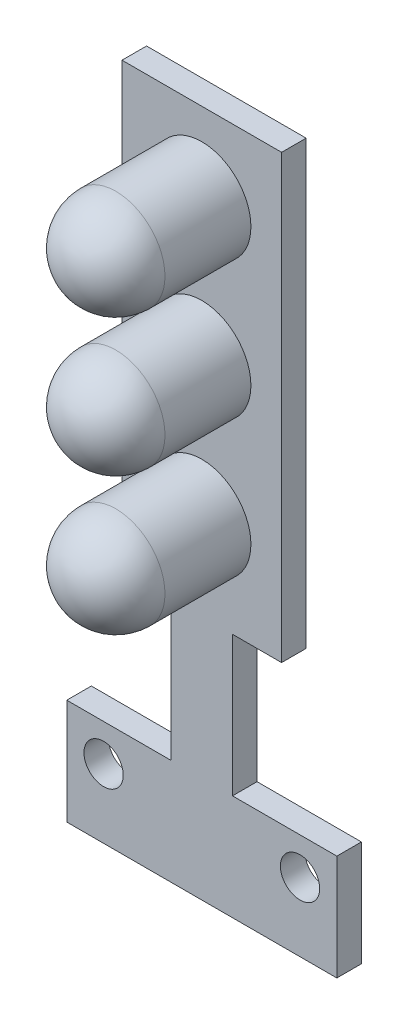
ISO-10303-21;
HEADER;
FILE_DESCRIPTION(('STEP AP214'),'2;1');
FILE_NAME('part.step','',(''),(''),'','','');
FILE_SCHEMA(('AUTOMOTIVE_DESIGN { 1 0 10303 214 1 1 1 1 }'));
ENDSEC;
DATA;
#1=APPLICATION_CONTEXT('core data for automotive mechanical design processes');
#2=APPLICATION_PROTOCOL_DEFINITION('international standard','automotive_design',2000,#1);
#3=PRODUCT_CONTEXT('',#1,'mechanical');
#4=PRODUCT('Part','Part','',(#3));
#5=PRODUCT_RELATED_PRODUCT_CATEGORY('part','',(#4));
#6=PRODUCT_DEFINITION_FORMATION('','',#4);
#7=PRODUCT_DEFINITION_CONTEXT('part definition',#1,'design');
#8=PRODUCT_DEFINITION('design','',#6,#7);
#9=PRODUCT_DEFINITION_SHAPE('','',#8);
#10=(LENGTH_UNIT() NAMED_UNIT(*) SI_UNIT(.MILLI.,.METRE.));
#11=(NAMED_UNIT(*) PLANE_ANGLE_UNIT() SI_UNIT($,.RADIAN.));
#12=(NAMED_UNIT(*) SI_UNIT($,.STERADIAN.) SOLID_ANGLE_UNIT());
#13=UNCERTAINTY_MEASURE_WITH_UNIT(LENGTH_MEASURE(1.E-05),#10,'distance_accuracy_value','');
#14=(GEOMETRIC_REPRESENTATION_CONTEXT(3) GLOBAL_UNCERTAINTY_ASSIGNED_CONTEXT((#13)) GLOBAL_UNIT_ASSIGNED_CONTEXT((#10,
#11,#12)) REPRESENTATION_CONTEXT('',''));
#15=CARTESIAN_POINT('',(0.,0.,0.));
#16=DIRECTION('',(0.,0.,1.));
#17=DIRECTION('',(1.,0.,0.));
#18=AXIS2_PLACEMENT_3D('',#15,#16,#17);
#19=CARTESIAN_POINT('',(0.,-28.,2.));
#20=DIRECTION('',(0.,1.,0.));
#21=DIRECTION('',(-1.,0.,0.));
#22=AXIS2_PLACEMENT_3D('',#19,#20,#21);
#23=PLANE('',#22);
#24=DIRECTION('',(1.,0.,0.));
#25=VECTOR('',#24,1.);
#26=CARTESIAN_POINT('',(0.,-28.,0.));
#27=LINE('',#26,#25);
#28=CARTESIAN_POINT('',(-11.,-28.,0.));
#29=VERTEX_POINT('',#28);
#30=CARTESIAN_POINT('',(11.,-28.,0.));
#31=VERTEX_POINT('',#30);
#32=EDGE_CURVE('E163',#29,#31,#27,.T.);
#33=ORIENTED_EDGE('',*,*,#32,.T.);
#34=DIRECTION('',(0.,0.,-1.));
#35=VECTOR('',#34,1.);
#36=CARTESIAN_POINT('',(11.,-28.,2.));
#37=LINE('',#36,#35);
#38=CARTESIAN_POINT('',(11.,-28.,2.));
#39=VERTEX_POINT('',#38);
#40=EDGE_CURVE('E214',#39,#31,#37,.T.);
#41=ORIENTED_EDGE('',*,*,#40,.F.);
#42=DIRECTION('',(1.,0.,0.));
#43=VECTOR('',#42,1.);
#44=CARTESIAN_POINT('',(0.,-28.,2.));
#45=LINE('',#44,#43);
#46=CARTESIAN_POINT('',(-11.,-28.,2.));
#47=VERTEX_POINT('',#46);
#48=EDGE_CURVE('E105',#47,#39,#45,.T.);
#49=ORIENTED_EDGE('',*,*,#48,.F.);
#50=DIRECTION('',(0.,0.,-1.));
#51=VECTOR('',#50,1.);
#52=CARTESIAN_POINT('',(-11.,-28.,2.));
#53=LINE('',#52,#51);
#54=EDGE_CURVE('E159',#47,#29,#53,.T.);
#55=ORIENTED_EDGE('',*,*,#54,.T.);
#56=EDGE_LOOP('',(#33,#41,#49,#55));
#57=FACE_BOUND('',#56,.T.);
#58=ADVANCED_FACE('F35',(#57),#23,.F.);
#59=CARTESIAN_POINT('',(11.,0.,2.));
#60=DIRECTION('',(1.,0.,0.));
#61=DIRECTION('',(0.,1.,0.));
#62=AXIS2_PLACEMENT_3D('',#59,#60,#61);
#63=PLANE('',#62);
#64=DIRECTION('',(0.,-1.,0.));
#65=VECTOR('',#64,1.);
#66=CARTESIAN_POINT('',(11.,0.,0.));
#67=LINE('',#66,#65);
#68=CARTESIAN_POINT('',(11.,-19.4,0.));
#69=VERTEX_POINT('',#68);
#70=EDGE_CURVE('E167',#69,#31,#67,.T.);
#71=ORIENTED_EDGE('',*,*,#70,.F.);
#72=DIRECTION('',(0.,0.,-1.));
#73=VECTOR('',#72,1.);
#74=CARTESIAN_POINT('',(11.,-19.4,2.));
#75=LINE('',#74,#73);
#76=CARTESIAN_POINT('',(11.,-19.4,2.));
#77=VERTEX_POINT('',#76);
#78=EDGE_CURVE('E212',#77,#69,#75,.T.);
#79=ORIENTED_EDGE('',*,*,#78,.F.);
#80=DIRECTION('',(0.,-1.,0.));
#81=VECTOR('',#80,1.);
#82=CARTESIAN_POINT('',(11.,0.,2.));
#83=LINE('',#82,#81);
#84=EDGE_CURVE('E274',#77,#39,#83,.T.);
#85=ORIENTED_EDGE('',*,*,#84,.T.);
#86=ORIENTED_EDGE('',*,*,#40,.T.);
#87=EDGE_LOOP('',(#71,#79,#85,#86));
#88=FACE_BOUND('',#87,.T.);
#89=ADVANCED_FACE('F235',(#88),#63,.T.);
#90=CARTESIAN_POINT('',(0.,-19.4,2.));
#91=DIRECTION('',(0.,1.,0.));
#92=DIRECTION('',(0.,0.,1.));
#93=AXIS2_PLACEMENT_3D('',#90,#91,#92);
#94=PLANE('',#93);
#95=DIRECTION('',(1.,0.,0.));
#96=VECTOR('',#95,1.);
#97=CARTESIAN_POINT('',(0.,-19.4,0.));
#98=LINE('',#97,#96);
#99=CARTESIAN_POINT('',(2.49999999999999,-19.4,0.));
#100=VERTEX_POINT('',#99);
#101=EDGE_CURVE('E170',#100,#69,#98,.T.);
#102=ORIENTED_EDGE('',*,*,#101,.F.);
#103=DIRECTION('',(0.,0.,-1.));
#104=VECTOR('',#103,1.);
#105=CARTESIAN_POINT('',(2.49999999999999,-19.4,2.));
#106=LINE('',#105,#104);
#107=CARTESIAN_POINT('',(2.49999999999999,-19.4,2.));
#108=VERTEX_POINT('',#107);
#109=EDGE_CURVE('E210',#108,#100,#106,.T.);
#110=ORIENTED_EDGE('',*,*,#109,.F.);
#111=DIRECTION('',(1.,0.,0.));
#112=VECTOR('',#111,1.);
#113=CARTESIAN_POINT('',(0.,-19.4,2.));
#114=LINE('',#113,#112);
#115=EDGE_CURVE('E276',#108,#77,#114,.T.);
#116=ORIENTED_EDGE('',*,*,#115,.T.);
#117=ORIENTED_EDGE('',*,*,#78,.T.);
#118=EDGE_LOOP('',(#102,#110,#116,#117));
#119=FACE_BOUND('',#118,.T.);
#120=ADVANCED_FACE('F241',(#119),#94,.T.);
#121=CARTESIAN_POINT('',(2.49999999999999,0.,2.));
#122=DIRECTION('',(1.,0.,0.));
#123=DIRECTION('',(0.,1.,0.));
#124=AXIS2_PLACEMENT_3D('',#121,#122,#123);
#125=PLANE('',#124);
#126=DIRECTION('',(0.,-1.,0.));
#127=VECTOR('',#126,1.);
#128=CARTESIAN_POINT('',(2.49999999999999,0.,0.));
#129=LINE('',#128,#127);
#130=CARTESIAN_POINT('',(2.49999999999999,-7.99999999999997,0.));
#131=VERTEX_POINT('',#130);
#132=EDGE_CURVE('E173',#131,#100,#129,.T.);
#133=ORIENTED_EDGE('',*,*,#132,.F.);
#134=DIRECTION('',(0.,0.,-1.));
#135=VECTOR('',#134,1.);
#136=CARTESIAN_POINT('',(2.49999999999999,-7.99999999999997,2.));
#137=LINE('',#136,#135);
#138=CARTESIAN_POINT('',(2.49999999999999,-7.99999999999997,2.));
#139=VERTEX_POINT('',#138);
#140=EDGE_CURVE('E208',#139,#131,#137,.T.);
#141=ORIENTED_EDGE('',*,*,#140,.F.);
#142=DIRECTION('',(0.,-1.,0.));
#143=VECTOR('',#142,1.);
#144=CARTESIAN_POINT('',(2.49999999999999,0.,2.));
#145=LINE('',#144,#143);
#146=EDGE_CURVE('E283',#139,#108,#145,.T.);
#147=ORIENTED_EDGE('',*,*,#146,.T.);
#148=ORIENTED_EDGE('',*,*,#109,.T.);
#149=EDGE_LOOP('',(#133,#141,#147,#148));
#150=FACE_BOUND('',#149,.T.);
#151=ADVANCED_FACE('F318',(#150),#125,.T.);
#152=CARTESIAN_POINT('',(0.,-7.99999999999997,2.));
#153=DIRECTION('',(0.,-1.,0.));
#154=DIRECTION('',(0.,0.,-1.));
#155=AXIS2_PLACEMENT_3D('',#152,#153,#154);
#156=PLANE('',#155);
#157=DIRECTION('',(-1.,0.,0.));
#158=VECTOR('',#157,1.);
#159=CARTESIAN_POINT('',(0.,-7.99999999999997,0.));
#160=LINE('',#159,#158);
#161=CARTESIAN_POINT('',(6.49999999999999,-7.99999999999997,0.));
#162=VERTEX_POINT('',#161);
#163=EDGE_CURVE('E176',#162,#131,#160,.T.);
#164=ORIENTED_EDGE('',*,*,#163,.F.);
#165=DIRECTION('',(0.,0.,-1.));
#166=VECTOR('',#165,1.);
#167=CARTESIAN_POINT('',(6.49999999999999,-7.99999999999997,2.));
#168=LINE('',#167,#166);
#169=CARTESIAN_POINT('',(6.49999999999999,-7.99999999999997,2.));
#170=VERTEX_POINT('',#169);
#171=EDGE_CURVE('E206',#170,#162,#168,.T.);
#172=ORIENTED_EDGE('',*,*,#171,.F.);
#173=DIRECTION('',(-1.,0.,0.));
#174=VECTOR('',#173,1.);
#175=CARTESIAN_POINT('',(0.,-7.99999999999997,2.));
#176=LINE('',#175,#174);
#177=EDGE_CURVE('E286',#170,#139,#176,.T.);
#178=ORIENTED_EDGE('',*,*,#177,.T.);
#179=ORIENTED_EDGE('',*,*,#140,.T.);
#180=EDGE_LOOP('',(#164,#172,#178,#179));
#181=FACE_BOUND('',#180,.T.);
#182=ADVANCED_FACE('F314',(#181),#156,.T.);
#183=CARTESIAN_POINT('',(6.49999999999999,0.,2.));
#184=DIRECTION('',(1.,0.,0.));
#185=DIRECTION('',(0.,1.,0.));
#186=AXIS2_PLACEMENT_3D('',#183,#184,#185);
#187=PLANE('',#186);
#188=DIRECTION('',(0.,-1.,0.));
#189=VECTOR('',#188,1.);
#190=CARTESIAN_POINT('',(6.49999999999999,0.,0.));
#191=LINE('',#190,#189);
#192=CARTESIAN_POINT('',(6.49999999999999,28.,0.));
#193=VERTEX_POINT('',#192);
#194=EDGE_CURVE('E179',#193,#162,#191,.T.);
#195=ORIENTED_EDGE('',*,*,#194,.F.);
#196=DIRECTION('',(0.,0.,-1.));
#197=VECTOR('',#196,1.);
#198=CARTESIAN_POINT('',(6.49999999999999,28.,2.));
#199=LINE('',#198,#197);
#200=CARTESIAN_POINT('',(6.49999999999999,28.,2.));
#201=VERTEX_POINT('',#200);
#202=EDGE_CURVE('E204',#201,#193,#199,.T.);
#203=ORIENTED_EDGE('',*,*,#202,.F.);
#204=DIRECTION('',(0.,-1.,0.));
#205=VECTOR('',#204,1.);
#206=CARTESIAN_POINT('',(6.49999999999999,0.,2.));
#207=LINE('',#206,#205);
#208=EDGE_CURVE('E289',#201,#170,#207,.T.);
#209=ORIENTED_EDGE('',*,*,#208,.T.);
#210=ORIENTED_EDGE('',*,*,#171,.T.);
#211=EDGE_LOOP('',(#195,#203,#209,#210));
#212=FACE_BOUND('',#211,.T.);
#213=ADVANCED_FACE('F310',(#212),#187,.T.);
#214=CARTESIAN_POINT('',(0.,28.,2.));
#215=DIRECTION('',(0.,-1.,0.));
#216=DIRECTION('',(1.,0.,0.));
#217=AXIS2_PLACEMENT_3D('',#214,#215,#216);
#218=PLANE('',#217);
#219=DIRECTION('',(-1.,0.,0.));
#220=VECTOR('',#219,1.);
#221=CARTESIAN_POINT('',(0.,28.,0.));
#222=LINE('',#221,#220);
#223=CARTESIAN_POINT('',(-6.49999999999999,28.,0.));
#224=VERTEX_POINT('',#223);
#225=EDGE_CURVE('E182',#193,#224,#222,.T.);
#226=ORIENTED_EDGE('',*,*,#225,.T.);
#227=DIRECTION('',(0.,0.,-1.));
#228=VECTOR('',#227,1.);
#229=CARTESIAN_POINT('',(-6.49999999999999,28.,2.));
#230=LINE('',#229,#228);
#231=CARTESIAN_POINT('',(-6.49999999999999,28.,2.));
#232=VERTEX_POINT('',#231);
#233=EDGE_CURVE('E201',#232,#224,#230,.T.);
#234=ORIENTED_EDGE('',*,*,#233,.F.);
#235=DIRECTION('',(-1.,0.,0.));
#236=VECTOR('',#235,1.);
#237=CARTESIAN_POINT('',(0.,28.,2.));
#238=LINE('',#237,#236);
#239=EDGE_CURVE('E292',#201,#232,#238,.T.);
#240=ORIENTED_EDGE('',*,*,#239,.F.);
#241=ORIENTED_EDGE('',*,*,#202,.T.);
#242=EDGE_LOOP('',(#226,#234,#240,#241));
#243=FACE_BOUND('',#242,.T.);
#244=ADVANCED_FACE('F332',(#243),#218,.F.);
#245=CARTESIAN_POINT('',(-6.49999999999999,0.,2.));
#246=DIRECTION('',(1.,0.,0.));
#247=DIRECTION('',(0.,1.,0.));
#248=AXIS2_PLACEMENT_3D('',#245,#246,#247);
#249=PLANE('',#248);
#250=DIRECTION('',(0.,-1.,0.));
#251=VECTOR('',#250,1.);
#252=CARTESIAN_POINT('',(-6.49999999999999,0.,0.));
#253=LINE('',#252,#251);
#254=CARTESIAN_POINT('',(-6.49999999999999,-7.99999999999999,0.));
#255=VERTEX_POINT('',#254);
#256=EDGE_CURVE('E184',#224,#255,#253,.T.);
#257=ORIENTED_EDGE('',*,*,#256,.T.);
#258=DIRECTION('',(0.,0.,-1.));
#259=VECTOR('',#258,1.);
#260=CARTESIAN_POINT('',(-6.49999999999999,-7.99999999999999,2.));
#261=LINE('',#260,#259);
#262=CARTESIAN_POINT('',(-6.49999999999999,-7.99999999999999,2.));
#263=VERTEX_POINT('',#262);
#264=EDGE_CURVE('E198',#263,#255,#261,.T.);
#265=ORIENTED_EDGE('',*,*,#264,.F.);
#266=DIRECTION('',(0.,-1.,0.));
#267=VECTOR('',#266,1.);
#268=CARTESIAN_POINT('',(-6.49999999999999,0.,2.));
#269=LINE('',#268,#267);
#270=EDGE_CURVE('E294',#232,#263,#269,.T.);
#271=ORIENTED_EDGE('',*,*,#270,.F.);
#272=ORIENTED_EDGE('',*,*,#233,.T.);
#273=EDGE_LOOP('',(#257,#265,#271,#272));
#274=FACE_BOUND('',#273,.T.);
#275=ADVANCED_FACE('F301',(#274),#249,.F.);
#276=CARTESIAN_POINT('',(0.,-7.99999999999999,2.));
#277=DIRECTION('',(0.,1.,0.));
#278=DIRECTION('',(0.,0.,1.));
#279=AXIS2_PLACEMENT_3D('',#276,#277,#278);
#280=PLANE('',#279);
#281=DIRECTION('',(1.,0.,0.));
#282=VECTOR('',#281,1.);
#283=CARTESIAN_POINT('',(0.,-7.99999999999999,0.));
#284=LINE('',#283,#282);
#285=CARTESIAN_POINT('',(-2.49999999999999,-7.99999999999999,0.));
#286=VERTEX_POINT('',#285);
#287=EDGE_CURVE('E186',#255,#286,#284,.T.);
#288=ORIENTED_EDGE('',*,*,#287,.T.);
#289=DIRECTION('',(0.,0.,-1.));
#290=VECTOR('',#289,1.);
#291=CARTESIAN_POINT('',(-2.49999999999999,-7.99999999999999,2.));
#292=LINE('',#291,#290);
#293=CARTESIAN_POINT('',(-2.49999999999999,-7.99999999999999,2.));
#294=VERTEX_POINT('',#293);
#295=EDGE_CURVE('E148',#294,#286,#292,.T.);
#296=ORIENTED_EDGE('',*,*,#295,.F.);
#297=DIRECTION('',(1.,0.,0.));
#298=VECTOR('',#297,1.);
#299=CARTESIAN_POINT('',(0.,-7.99999999999999,2.));
#300=LINE('',#299,#298);
#301=EDGE_CURVE('E139',#263,#294,#300,.T.);
#302=ORIENTED_EDGE('',*,*,#301,.F.);
#303=ORIENTED_EDGE('',*,*,#264,.T.);
#304=EDGE_LOOP('',(#288,#296,#302,#303));
#305=FACE_BOUND('',#304,.T.);
#306=ADVANCED_FACE('F305',(#305),#280,.F.);
#307=CARTESIAN_POINT('',(-2.49999999999999,0.,2.));
#308=DIRECTION('',(1.,0.,0.));
#309=DIRECTION('',(0.,1.,0.));
#310=AXIS2_PLACEMENT_3D('',#307,#308,#309);
#311=PLANE('',#310);
#312=DIRECTION('',(0.,-1.,0.));
#313=VECTOR('',#312,1.);
#314=CARTESIAN_POINT('',(-2.49999999999999,0.,0.));
#315=LINE('',#314,#313);
#316=CARTESIAN_POINT('',(-2.49999999999999,-19.4,0.));
#317=VERTEX_POINT('',#316);
#318=EDGE_CURVE('E147',#286,#317,#315,.T.);
#319=ORIENTED_EDGE('',*,*,#318,.T.);
#320=DIRECTION('',(0.,0.,-1.));
#321=VECTOR('',#320,1.);
#322=CARTESIAN_POINT('',(-2.49999999999999,-19.4,2.));
#323=LINE('',#322,#321);
#324=CARTESIAN_POINT('',(-2.49999999999999,-19.4,2.));
#325=VERTEX_POINT('',#324);
#326=EDGE_CURVE('E144',#325,#317,#323,.T.);
#327=ORIENTED_EDGE('',*,*,#326,.F.);
#328=DIRECTION('',(0.,-1.,0.));
#329=VECTOR('',#328,1.);
#330=CARTESIAN_POINT('',(-2.49999999999999,0.,2.));
#331=LINE('',#330,#329);
#332=EDGE_CURVE('E132',#294,#325,#331,.T.);
#333=ORIENTED_EDGE('',*,*,#332,.F.);
#334=ORIENTED_EDGE('',*,*,#295,.T.);
#335=EDGE_LOOP('',(#319,#327,#333,#334));
#336=FACE_BOUND('',#335,.T.);
#337=ADVANCED_FACE('F145',(#336),#311,.F.);
#338=CARTESIAN_POINT('',(0.,-19.4,2.));
#339=DIRECTION('',(0.,-1.,0.));
#340=DIRECTION('',(0.,0.,-1.));
#341=AXIS2_PLACEMENT_3D('',#338,#339,#340);
#342=PLANE('',#341);
#343=DIRECTION('',(-1.,0.,0.));
#344=VECTOR('',#343,1.);
#345=CARTESIAN_POINT('',(0.,-19.4,0.));
#346=LINE('',#345,#344);
#347=CARTESIAN_POINT('',(-11.,-19.4,0.));
#348=VERTEX_POINT('',#347);
#349=EDGE_CURVE('E93',#317,#348,#346,.T.);
#350=ORIENTED_EDGE('',*,*,#349,.T.);
#351=DIRECTION('',(0.,0.,-1.));
#352=VECTOR('',#351,1.);
#353=CARTESIAN_POINT('',(-11.,-19.4,2.));
#354=LINE('',#353,#352);
#355=CARTESIAN_POINT('',(-11.,-19.4,2.));
#356=VERTEX_POINT('',#355);
#357=EDGE_CURVE('E149',#356,#348,#354,.T.);
#358=ORIENTED_EDGE('',*,*,#357,.F.);
#359=DIRECTION('',(-1.,0.,0.));
#360=VECTOR('',#359,1.);
#361=CARTESIAN_POINT('',(0.,-19.4,2.));
#362=LINE('',#361,#360);
#363=EDGE_CURVE('E137',#325,#356,#362,.T.);
#364=ORIENTED_EDGE('',*,*,#363,.F.);
#365=ORIENTED_EDGE('',*,*,#326,.T.);
#366=EDGE_LOOP('',(#350,#358,#364,#365));
#367=FACE_BOUND('',#366,.T.);
#368=ADVANCED_FACE('F151',(#367),#342,.F.);
#369=CARTESIAN_POINT('',(-11.,0.,2.));
#370=DIRECTION('',(1.,0.,0.));
#371=DIRECTION('',(0.,1.,0.));
#372=AXIS2_PLACEMENT_3D('',#369,#370,#371);
#373=PLANE('',#372);
#374=DIRECTION('',(0.,-1.,0.));
#375=VECTOR('',#374,1.);
#376=CARTESIAN_POINT('',(-11.,0.,0.));
#377=LINE('',#376,#375);
#378=EDGE_CURVE('E99',#348,#29,#377,.T.);
#379=ORIENTED_EDGE('',*,*,#378,.T.);
#380=ORIENTED_EDGE('',*,*,#54,.F.);
#381=DIRECTION('',(0.,-1.,0.));
#382=VECTOR('',#381,1.);
#383=CARTESIAN_POINT('',(-11.,0.,2.));
#384=LINE('',#383,#382);
#385=EDGE_CURVE('E52',#356,#47,#384,.T.);
#386=ORIENTED_EDGE('',*,*,#385,.F.);
#387=ORIENTED_EDGE('',*,*,#357,.T.);
#388=EDGE_LOOP('',(#379,#380,#386,#387));
#389=FACE_BOUND('',#388,.T.);
#390=ADVANCED_FACE('F249',(#389),#373,.F.);
#391=CARTESIAN_POINT('',(-7.99999999999999,-22.4,2.));
#392=DIRECTION('',(0.,0.,-1.));
#393=DIRECTION('',(-1.,0.,0.));
#394=AXIS2_PLACEMENT_3D('',#391,#392,#393);
#395=CYLINDRICAL_SURFACE('',#394,1.6);
#396=CARTESIAN_POINT('',(-7.99999999999999,-22.4,2.));
#397=DIRECTION('',(0.,0.,1.));
#398=DIRECTION('',(1.,0.,0.));
#399=AXIS2_PLACEMENT_3D('',#396,#397,#398);
#400=CIRCLE('',#399,1.6);
#401=CARTESIAN_POINT('',(-6.39999999999999,-22.4,2.));
#402=VERTEX_POINT('',#401);
#403=EDGE_CURVE('E194',#402,#402,#400,.T.);
#404=ORIENTED_EDGE('',*,*,#403,.T.);
#405=EDGE_LOOP('',(#404));
#406=FACE_BOUND('',#405,.T.);
#407=CARTESIAN_POINT('',(-7.99999999999999,-22.4,0.));
#408=DIRECTION('',(0.,0.,1.));
#409=DIRECTION('',(1.,0.,0.));
#410=AXIS2_PLACEMENT_3D('',#407,#408,#409);
#411=CIRCLE('',#410,1.6);
#412=CARTESIAN_POINT('',(-6.39999999999999,-22.4,0.));
#413=VERTEX_POINT('',#412);
#414=EDGE_CURVE('E160',#413,#413,#411,.T.);
#415=ORIENTED_EDGE('',*,*,#414,.F.);
#416=EDGE_LOOP('',(#415));
#417=FACE_BOUND('',#416,.T.);
#418=ADVANCED_FACE('F246',(#406,#417),#395,.F.);
#419=CARTESIAN_POINT('',(8.00000000000002,-22.4,2.));
#420=DIRECTION('',(0.,0.,-1.));
#421=DIRECTION('',(-1.,0.,0.));
#422=AXIS2_PLACEMENT_3D('',#419,#420,#421);
#423=CYLINDRICAL_SURFACE('',#422,1.6);
#424=CARTESIAN_POINT('',(8.00000000000002,-22.4,2.));
#425=DIRECTION('',(0.,0.,1.));
#426=DIRECTION('',(1.,0.,0.));
#427=AXIS2_PLACEMENT_3D('',#424,#425,#426);
#428=CIRCLE('',#427,1.6);
#429=CARTESIAN_POINT('',(9.60000000000002,-22.4,2.));
#430=VERTEX_POINT('',#429);
#431=EDGE_CURVE('E153',#430,#430,#428,.F.);
#432=ORIENTED_EDGE('',*,*,#431,.F.);
#433=EDGE_LOOP('',(#432));
#434=FACE_BOUND('',#433,.T.);
#435=CARTESIAN_POINT('',(8.00000000000002,-22.4,0.));
#436=DIRECTION('',(0.,0.,1.));
#437=DIRECTION('',(1.,0.,0.));
#438=AXIS2_PLACEMENT_3D('',#435,#436,#437);
#439=CIRCLE('',#438,1.6);
#440=CARTESIAN_POINT('',(9.60000000000002,-22.4,0.));
#441=VERTEX_POINT('',#440);
#442=EDGE_CURVE('E191',#441,#441,#439,.F.);
#443=ORIENTED_EDGE('',*,*,#442,.T.);
#444=EDGE_LOOP('',(#443));
#445=FACE_BOUND('',#444,.T.);
#446=ADVANCED_FACE('F248',(#434,#445),#423,.F.);
#447=CARTESIAN_POINT('',(0.,0.,2.));
#448=DIRECTION('',(0.,0.,1.));
#449=DIRECTION('',(1.,0.,0.));
#450=AXIS2_PLACEMENT_3D('',#447,#448,#449);
#451=PLANE('',#450);
#452=CARTESIAN_POINT('',(0.,-0.899999999999995,2.));
#453=DIRECTION('',(0.,0.,1.));
#454=DIRECTION('',(1.,0.,0.));
#455=AXIS2_PLACEMENT_3D('',#452,#453,#454);
#456=CIRCLE('',#455,4.);
#457=CARTESIAN_POINT('',(4.,-0.899999999999995,2.));
#458=VERTEX_POINT('',#457);
#459=EDGE_CURVE('E490',#458,#458,#456,.T.);
#460=ORIENTED_EDGE('',*,*,#459,.F.);
#461=EDGE_LOOP('',(#460));
#462=FACE_BOUND('',#461,.T.);
#463=CARTESIAN_POINT('',(0.,10.3,2.));
#464=DIRECTION('',(0.,0.,1.));
#465=DIRECTION('',(1.,0.,0.));
#466=AXIS2_PLACEMENT_3D('',#463,#464,#465);
#467=CIRCLE('',#466,4.);
#468=CARTESIAN_POINT('',(4.,10.3,2.));
#469=VERTEX_POINT('',#468);
#470=EDGE_CURVE('E488',#469,#469,#467,.T.);
#471=ORIENTED_EDGE('',*,*,#470,.F.);
#472=EDGE_LOOP('',(#471));
#473=FACE_BOUND('',#472,.T.);
#474=CARTESIAN_POINT('',(0.,21.5,2.));
#475=DIRECTION('',(0.,0.,1.));
#476=DIRECTION('',(1.,0.,0.));
#477=AXIS2_PLACEMENT_3D('',#474,#475,#476);
#478=CIRCLE('',#477,4.);
#479=CARTESIAN_POINT('',(4.,21.5,2.));
#480=VERTEX_POINT('',#479);
#481=EDGE_CURVE('E164',#480,#480,#478,.T.);
#482=ORIENTED_EDGE('',*,*,#481,.F.);
#483=EDGE_LOOP('',(#482));
#484=FACE_BOUND('',#483,.T.);
#485=ORIENTED_EDGE('',*,*,#403,.F.);
#486=EDGE_LOOP('',(#485));
#487=FACE_BOUND('',#486,.T.);
#488=ORIENTED_EDGE('',*,*,#48,.T.);
#489=ORIENTED_EDGE('',*,*,#84,.F.);
#490=ORIENTED_EDGE('',*,*,#115,.F.);
#491=ORIENTED_EDGE('',*,*,#146,.F.);
#492=ORIENTED_EDGE('',*,*,#177,.F.);
#493=ORIENTED_EDGE('',*,*,#208,.F.);
#494=ORIENTED_EDGE('',*,*,#239,.T.);
#495=ORIENTED_EDGE('',*,*,#270,.T.);
#496=ORIENTED_EDGE('',*,*,#301,.T.);
#497=ORIENTED_EDGE('',*,*,#332,.T.);
#498=ORIENTED_EDGE('',*,*,#363,.T.);
#499=ORIENTED_EDGE('',*,*,#385,.T.);
#500=EDGE_LOOP('',(#488,#489,#490,#491,#492,#493,#494,#495,#496,#497,#498,#499));
#501=FACE_BOUND('',#500,.T.);
#502=ORIENTED_EDGE('',*,*,#431,.T.);
#503=EDGE_LOOP('',(#502));
#504=FACE_BOUND('',#503,.T.);
#505=ADVANCED_FACE('F134',(#462,#473,#484,#487,#501,#504),#451,.T.);
#506=CARTESIAN_POINT('',(0.,0.,0.));
#507=DIRECTION('',(0.,0.,1.));
#508=DIRECTION('',(1.,0.,0.));
#509=AXIS2_PLACEMENT_3D('',#506,#507,#508);
#510=PLANE('',#509);
#511=ORIENTED_EDGE('',*,*,#414,.T.);
#512=EDGE_LOOP('',(#511));
#513=FACE_BOUND('',#512,.T.);
#514=ORIENTED_EDGE('',*,*,#32,.F.);
#515=ORIENTED_EDGE('',*,*,#378,.F.);
#516=ORIENTED_EDGE('',*,*,#349,.F.);
#517=ORIENTED_EDGE('',*,*,#318,.F.);
#518=ORIENTED_EDGE('',*,*,#287,.F.);
#519=ORIENTED_EDGE('',*,*,#256,.F.);
#520=ORIENTED_EDGE('',*,*,#225,.F.);
#521=ORIENTED_EDGE('',*,*,#194,.T.);
#522=ORIENTED_EDGE('',*,*,#163,.T.);
#523=ORIENTED_EDGE('',*,*,#132,.T.);
#524=ORIENTED_EDGE('',*,*,#101,.T.);
#525=ORIENTED_EDGE('',*,*,#70,.T.);
#526=EDGE_LOOP('',(#514,#515,#516,#517,#518,#519,#520,#521,#522,#523,#524,#525));
#527=FACE_BOUND('',#526,.T.);
#528=ORIENTED_EDGE('',*,*,#442,.F.);
#529=EDGE_LOOP('',(#528));
#530=FACE_BOUND('',#529,.T.);
#531=ADVANCED_FACE('F263',(#513,#527,#530),#510,.F.);
#532=CARTESIAN_POINT('',(0.,21.5,13.));
#533=DIRECTION('',(0.,0.,-1.));
#534=DIRECTION('',(-1.,0.,0.));
#535=AXIS2_PLACEMENT_3D('',#532,#533,#534);
#536=CYLINDRICAL_SURFACE('',#535,4.);
#537=CARTESIAN_POINT('',(0.,21.5,9.));
#538=DIRECTION('',(0.,0.,-1.));
#539=DIRECTION('',(-1.,0.,0.));
#540=AXIS2_PLACEMENT_3D('',#537,#538,#539);
#541=CIRCLE('',#540,4.);
#542=CARTESIAN_POINT('',(-4.,21.5,9.));
#543=VERTEX_POINT('',#542);
#544=EDGE_CURVE('E216',#543,#543,#541,.T.);
#545=ORIENTED_EDGE('',*,*,#544,.T.);
#546=EDGE_LOOP('',(#545));
#547=FACE_BOUND('',#546,.T.);
#548=ORIENTED_EDGE('',*,*,#481,.T.);
#549=EDGE_LOOP('',(#548));
#550=FACE_BOUND('',#549,.T.);
#551=ADVANCED_FACE('F266',(#547,#550),#536,.T.);
#552=CARTESIAN_POINT('',(0.,10.3,13.));
#553=DIRECTION('',(0.,0.,-1.));
#554=DIRECTION('',(-1.,0.,0.));
#555=AXIS2_PLACEMENT_3D('',#552,#553,#554);
#556=CYLINDRICAL_SURFACE('',#555,4.);
#557=CARTESIAN_POINT('',(0.,10.3,9.));
#558=DIRECTION('',(0.,0.,-1.));
#559=DIRECTION('',(-1.,0.,0.));
#560=AXIS2_PLACEMENT_3D('',#557,#558,#559);
#561=CIRCLE('',#560,4.);
#562=CARTESIAN_POINT('',(-4.,10.3,9.));
#563=VERTEX_POINT('',#562);
#564=EDGE_CURVE('E11',#563,#563,#561,.T.);
#565=ORIENTED_EDGE('',*,*,#564,.T.);
#566=EDGE_LOOP('',(#565));
#567=FACE_BOUND('',#566,.T.);
#568=ORIENTED_EDGE('',*,*,#470,.T.);
#569=EDGE_LOOP('',(#568));
#570=FACE_BOUND('',#569,.T.);
#571=ADVANCED_FACE('F348',(#567,#570),#556,.T.);
#572=CARTESIAN_POINT('',(0.,-0.899999999999995,13.));
#573=DIRECTION('',(0.,0.,-1.));
#574=DIRECTION('',(-1.,0.,0.));
#575=AXIS2_PLACEMENT_3D('',#572,#573,#574);
#576=CYLINDRICAL_SURFACE('',#575,4.);
#577=CARTESIAN_POINT('',(0.,-0.899999999999995,9.));
#578=DIRECTION('',(0.,0.,-1.));
#579=DIRECTION('',(-1.,0.,0.));
#580=AXIS2_PLACEMENT_3D('',#577,#578,#579);
#581=CIRCLE('',#580,4.);
#582=CARTESIAN_POINT('',(-4.,-0.899999999999995,9.));
#583=VERTEX_POINT('',#582);
#584=EDGE_CURVE('E44',#583,#583,#581,.T.);
#585=ORIENTED_EDGE('',*,*,#584,.T.);
#586=EDGE_LOOP('',(#585));
#587=FACE_BOUND('',#586,.T.);
#588=ORIENTED_EDGE('',*,*,#459,.T.);
#589=EDGE_LOOP('',(#588));
#590=FACE_BOUND('',#589,.T.);
#591=ADVANCED_FACE('F221',(#587,#590),#576,.T.);
#592=CARTESIAN_POINT('',(0.,21.5,9.));
#593=DIRECTION('',(0.,0.,1.));
#594=DIRECTION('',(1.,0.,0.));
#595=AXIS2_PLACEMENT_3D('',#592,#593,#594);
#596=SPHERICAL_SURFACE('',#595,4.);
#597=ORIENTED_EDGE('',*,*,#544,.F.);
#598=EDGE_LOOP('',(#597));
#599=FACE_BOUND('',#598,.T.);
#600=ADVANCED_FACE('F226',(#599),#596,.T.);
#601=CARTESIAN_POINT('',(0.,-0.899999999999995,9.));
#602=DIRECTION('',(0.,0.,1.));
#603=DIRECTION('',(1.,0.,0.));
#604=AXIS2_PLACEMENT_3D('',#601,#602,#603);
#605=SPHERICAL_SURFACE('',#604,4.);
#606=ORIENTED_EDGE('',*,*,#584,.F.);
#607=EDGE_LOOP('',(#606));
#608=FACE_BOUND('',#607,.T.);
#609=ADVANCED_FACE('F224',(#608),#605,.T.);
#610=CARTESIAN_POINT('',(0.,10.3,9.));
#611=DIRECTION('',(0.,0.,1.));
#612=DIRECTION('',(1.,0.,0.));
#613=AXIS2_PLACEMENT_3D('',#610,#611,#612);
#614=SPHERICAL_SURFACE('',#613,4.);
#615=ORIENTED_EDGE('',*,*,#564,.F.);
#616=EDGE_LOOP('',(#615));
#617=FACE_BOUND('',#616,.T.);
#618=ADVANCED_FACE('F37',(#617),#614,.T.);
#619=CLOSED_SHELL('',(#58,#89,#120,#151,#182,#213,#244,#275,#306,#337,#368,#390,#418,#446,#505,
#531,#551,#571,#591,#600,#609,#618));
#620=MANIFOLD_SOLID_BREP('B2',#619);
#621=ADVANCED_BREP_SHAPE_REPRESENTATION('',(#18,#620),#14);
#622=SHAPE_DEFINITION_REPRESENTATION(#9,#621);
ENDSEC;
END-ISO-10303-21;
